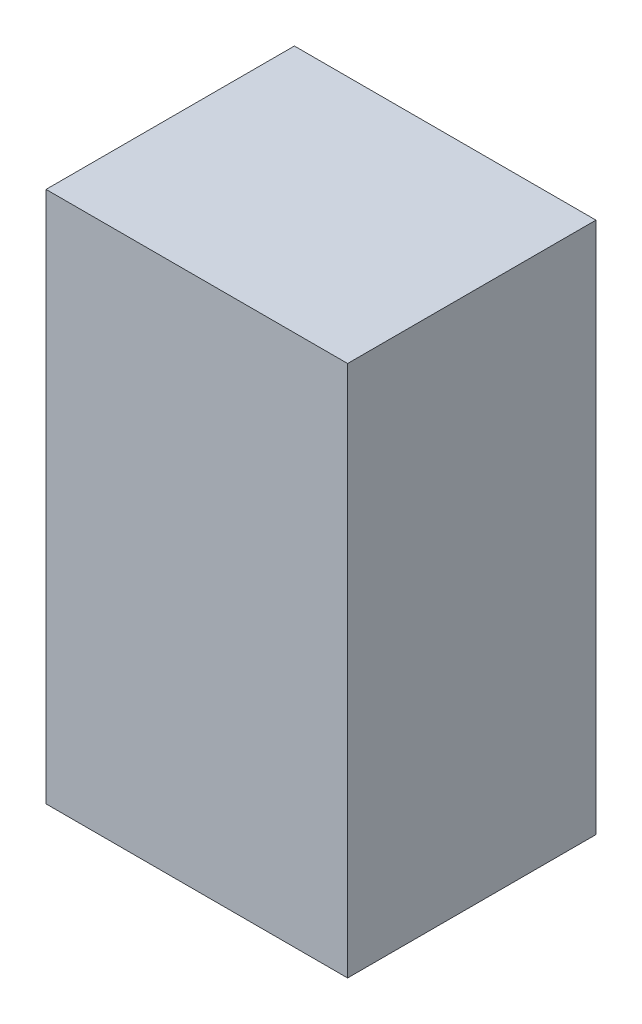
ISO-10303-21;
HEADER;
FILE_DESCRIPTION(('STEP AP214'),'2;1');
FILE_NAME('part.step','',(''),(''),'','','');
FILE_SCHEMA(('AUTOMOTIVE_DESIGN { 1 0 10303 214 1 1 1 1 }'));
ENDSEC;
DATA;
#1=APPLICATION_CONTEXT('core data for automotive mechanical design processes');
#2=APPLICATION_PROTOCOL_DEFINITION('international standard','automotive_design',2000,#1);
#3=PRODUCT_CONTEXT('',#1,'mechanical');
#4=PRODUCT('Part','Part','',(#3));
#5=PRODUCT_RELATED_PRODUCT_CATEGORY('part','',(#4));
#6=PRODUCT_DEFINITION_FORMATION('','',#4);
#7=PRODUCT_DEFINITION_CONTEXT('part definition',#1,'design');
#8=PRODUCT_DEFINITION('design','',#6,#7);
#9=PRODUCT_DEFINITION_SHAPE('','',#8);
#10=(LENGTH_UNIT() NAMED_UNIT(*) SI_UNIT(.MILLI.,.METRE.));
#11=(NAMED_UNIT(*) PLANE_ANGLE_UNIT() SI_UNIT($,.RADIAN.));
#12=(NAMED_UNIT(*) SI_UNIT($,.STERADIAN.) SOLID_ANGLE_UNIT());
#13=UNCERTAINTY_MEASURE_WITH_UNIT(LENGTH_MEASURE(1.E-05),#10,'distance_accuracy_value','');
#14=(GEOMETRIC_REPRESENTATION_CONTEXT(3) GLOBAL_UNCERTAINTY_ASSIGNED_CONTEXT((#13)) GLOBAL_UNIT_ASSIGNED_CONTEXT((#10,
#11,#12)) REPRESENTATION_CONTEXT('',''));
#15=CARTESIAN_POINT('',(0.,0.,0.));
#16=DIRECTION('',(0.,0.,1.));
#17=DIRECTION('',(1.,0.,0.));
#18=AXIS2_PLACEMENT_3D('',#15,#16,#17);
#19=CARTESIAN_POINT('',(-0.850010999999998,1.49999700000001,1.3999972));
#20=DIRECTION('',(0.,-1.,0.));
#21=DIRECTION('',(0.,0.,-1.));
#22=AXIS2_PLACEMENT_3D('',#19,#20,#21);
#23=PLANE('',#22);
#24=DIRECTION('',(-1.,0.,0.));
#25=VECTOR('',#24,1.);
#26=CARTESIAN_POINT('',(-0.850010999999998,1.49999700000001,0.));
#27=LINE('',#26,#25);
#28=CARTESIAN_POINT('',(0.850010999999998,1.49999700000001,0.));
#29=VERTEX_POINT('',#28);
#30=CARTESIAN_POINT('',(-0.850010999999998,1.49999700000001,0.));
#31=VERTEX_POINT('',#30);
#32=EDGE_CURVE('E95',#29,#31,#27,.T.);
#33=ORIENTED_EDGE('',*,*,#32,.T.);
#34=DIRECTION('',(0.,0.,-1.));
#35=VECTOR('',#34,1.);
#36=CARTESIAN_POINT('',(-0.850010999999998,1.49999700000001,1.3999972));
#37=LINE('',#36,#35);
#38=CARTESIAN_POINT('',(-0.850010999999998,1.49999700000001,1.3999972));
#39=VERTEX_POINT('',#38);
#40=EDGE_CURVE('E11',#39,#31,#37,.T.);
#41=ORIENTED_EDGE('',*,*,#40,.F.);
#42=DIRECTION('',(-1.,0.,0.));
#43=VECTOR('',#42,1.);
#44=CARTESIAN_POINT('',(-0.850010999999998,1.49999700000001,1.3999972));
#45=LINE('',#44,#43);
#46=CARTESIAN_POINT('',(0.850010999999998,1.49999700000001,1.3999972));
#47=VERTEX_POINT('',#46);
#48=EDGE_CURVE('E83',#47,#39,#45,.T.);
#49=ORIENTED_EDGE('',*,*,#48,.F.);
#50=DIRECTION('',(0.,0.,-1.));
#51=VECTOR('',#50,1.);
#52=CARTESIAN_POINT('',(0.850010999999998,1.49999700000001,1.3999972));
#53=LINE('',#52,#51);
#54=EDGE_CURVE('E91',#47,#29,#53,.T.);
#55=ORIENTED_EDGE('',*,*,#54,.T.);
#56=EDGE_LOOP('',(#33,#41,#49,#55));
#57=FACE_BOUND('',#56,.T.);
#58=ADVANCED_FACE('F32',(#57),#23,.F.);
#59=CARTESIAN_POINT('',(-0.850010999999998,-1.49999700000001,1.3999972));
#60=DIRECTION('',(1.,0.,0.));
#61=DIRECTION('',(0.,0.,-1.));
#62=AXIS2_PLACEMENT_3D('',#59,#60,#61);
#63=PLANE('',#62);
#64=DIRECTION('',(0.,-1.,0.));
#65=VECTOR('',#64,1.);
#66=CARTESIAN_POINT('',(-0.850010999999998,-1.49999700000001,0.));
#67=LINE('',#66,#65);
#68=CARTESIAN_POINT('',(-0.850010999999998,-1.49999700000001,0.));
#69=VERTEX_POINT('',#68);
#70=EDGE_CURVE('E87',#31,#69,#67,.T.);
#71=ORIENTED_EDGE('',*,*,#70,.T.);
#72=DIRECTION('',(0.,0.,-1.));
#73=VECTOR('',#72,1.);
#74=CARTESIAN_POINT('',(-0.850010999999998,-1.49999700000001,1.3999972));
#75=LINE('',#74,#73);
#76=CARTESIAN_POINT('',(-0.850010999999998,-1.49999700000001,1.3999972));
#77=VERTEX_POINT('',#76);
#78=EDGE_CURVE('E40',#77,#69,#75,.T.);
#79=ORIENTED_EDGE('',*,*,#78,.F.);
#80=DIRECTION('',(0.,-1.,0.));
#81=VECTOR('',#80,1.);
#82=CARTESIAN_POINT('',(-0.850010999999998,-1.49999700000001,1.3999972));
#83=LINE('',#82,#81);
#84=EDGE_CURVE('E78',#39,#77,#83,.T.);
#85=ORIENTED_EDGE('',*,*,#84,.F.);
#86=ORIENTED_EDGE('',*,*,#40,.T.);
#87=EDGE_LOOP('',(#71,#79,#85,#86));
#88=FACE_BOUND('',#87,.T.);
#89=ADVANCED_FACE('F86',(#88),#63,.F.);
#90=CARTESIAN_POINT('',(0.850010999999998,-1.49999700000001,1.3999972));
#91=DIRECTION('',(0.,1.,0.));
#92=DIRECTION('',(0.,0.,1.));
#93=AXIS2_PLACEMENT_3D('',#90,#91,#92);
#94=PLANE('',#93);
#95=DIRECTION('',(1.,0.,0.));
#96=VECTOR('',#95,1.);
#97=CARTESIAN_POINT('',(0.850010999999998,-1.49999700000001,0.));
#98=LINE('',#97,#96);
#99=CARTESIAN_POINT('',(0.850010999999998,-1.49999700000001,0.));
#100=VERTEX_POINT('',#99);
#101=EDGE_CURVE('E65',#69,#100,#98,.T.);
#102=ORIENTED_EDGE('',*,*,#101,.T.);
#103=DIRECTION('',(0.,0.,-1.));
#104=VECTOR('',#103,1.);
#105=CARTESIAN_POINT('',(0.850010999999998,-1.49999700000001,1.3999972));
#106=LINE('',#105,#104);
#107=CARTESIAN_POINT('',(0.850010999999998,-1.49999700000001,1.3999972));
#108=VERTEX_POINT('',#107);
#109=EDGE_CURVE('E88',#108,#100,#106,.T.);
#110=ORIENTED_EDGE('',*,*,#109,.F.);
#111=DIRECTION('',(1.,0.,0.));
#112=VECTOR('',#111,1.);
#113=CARTESIAN_POINT('',(0.850010999999998,-1.49999700000001,1.3999972));
#114=LINE('',#113,#112);
#115=EDGE_CURVE('E81',#77,#108,#114,.T.);
#116=ORIENTED_EDGE('',*,*,#115,.F.);
#117=ORIENTED_EDGE('',*,*,#78,.T.);
#118=EDGE_LOOP('',(#102,#110,#116,#117));
#119=FACE_BOUND('',#118,.T.);
#120=ADVANCED_FACE('F89',(#119),#94,.F.);
#121=CARTESIAN_POINT('',(0.850010999999998,1.49999700000001,1.3999972));
#122=DIRECTION('',(-1.,0.,0.));
#123=DIRECTION('',(0.,0.,1.));
#124=AXIS2_PLACEMENT_3D('',#121,#122,#123);
#125=PLANE('',#124);
#126=DIRECTION('',(0.,1.,0.));
#127=VECTOR('',#126,1.);
#128=CARTESIAN_POINT('',(0.850010999999998,1.49999700000001,0.));
#129=LINE('',#128,#127);
#130=EDGE_CURVE('E71',#100,#29,#129,.T.);
#131=ORIENTED_EDGE('',*,*,#130,.T.);
#132=ORIENTED_EDGE('',*,*,#54,.F.);
#133=DIRECTION('',(0.,1.,0.));
#134=VECTOR('',#133,1.);
#135=CARTESIAN_POINT('',(0.850010999999998,1.49999700000001,1.3999972));
#136=LINE('',#135,#134);
#137=EDGE_CURVE('E48',#108,#47,#136,.T.);
#138=ORIENTED_EDGE('',*,*,#137,.F.);
#139=ORIENTED_EDGE('',*,*,#109,.T.);
#140=EDGE_LOOP('',(#131,#132,#138,#139));
#141=FACE_BOUND('',#140,.T.);
#142=ADVANCED_FACE('F102',(#141),#125,.F.);
#143=CARTESIAN_POINT('',(0.,0.,1.3999972));
#144=DIRECTION('',(0.,0.,-1.));
#145=DIRECTION('',(-1.,0.,0.));
#146=AXIS2_PLACEMENT_3D('',#143,#144,#145);
#147=PLANE('',#146);
#148=ORIENTED_EDGE('',*,*,#48,.T.);
#149=ORIENTED_EDGE('',*,*,#84,.T.);
#150=ORIENTED_EDGE('',*,*,#115,.T.);
#151=ORIENTED_EDGE('',*,*,#137,.T.);
#152=EDGE_LOOP('',(#148,#149,#150,#151));
#153=FACE_BOUND('',#152,.T.);
#154=ADVANCED_FACE('F79',(#153),#147,.F.);
#155=CARTESIAN_POINT('',(0.,0.,0.));
#156=DIRECTION('',(0.,0.,-1.));
#157=DIRECTION('',(-1.,0.,0.));
#158=AXIS2_PLACEMENT_3D('',#155,#156,#157);
#159=PLANE('',#158);
#160=ORIENTED_EDGE('',*,*,#32,.F.);
#161=ORIENTED_EDGE('',*,*,#130,.F.);
#162=ORIENTED_EDGE('',*,*,#101,.F.);
#163=ORIENTED_EDGE('',*,*,#70,.F.);
#164=EDGE_LOOP('',(#160,#161,#162,#163));
#165=FACE_BOUND('',#164,.T.);
#166=ADVANCED_FACE('F105',(#165),#159,.T.);
#167=CLOSED_SHELL('',(#58,#89,#120,#142,#154,#166));
#168=MANIFOLD_SOLID_BREP('B2',#167);
#169=ADVANCED_BREP_SHAPE_REPRESENTATION('',(#18,#168),#14);
#170=SHAPE_DEFINITION_REPRESENTATION(#9,#169);
ENDSEC;
END-ISO-10303-21;
